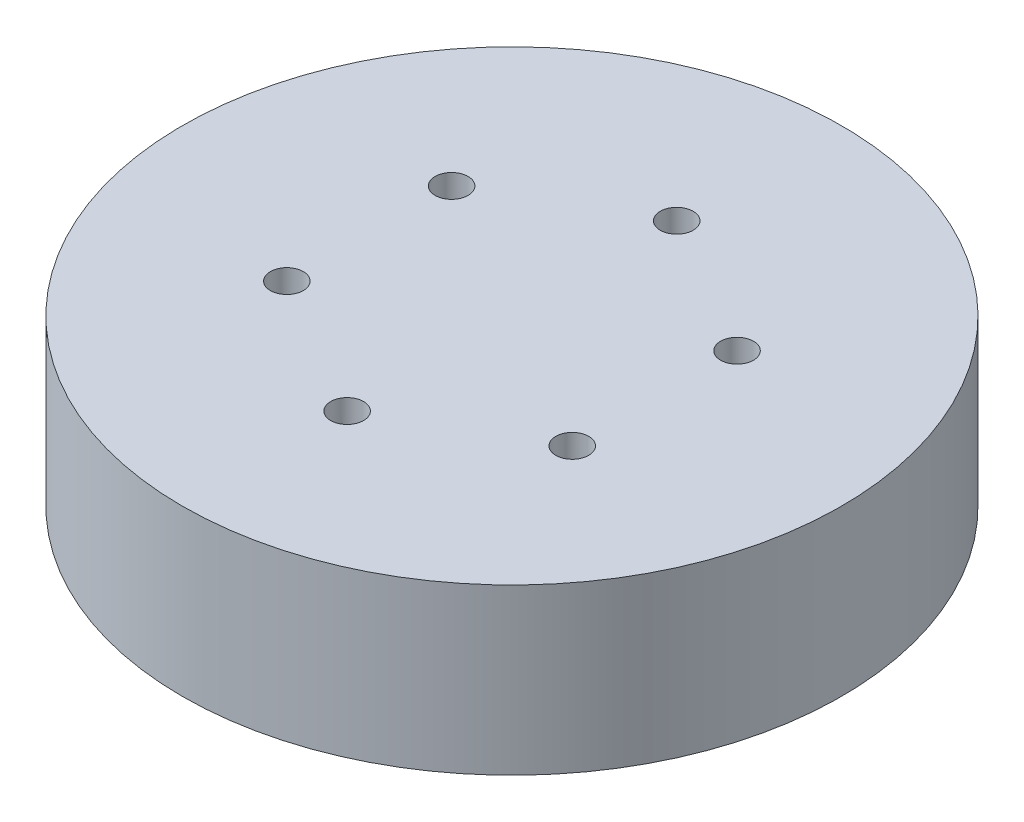
ISO-10303-21;
HEADER;
FILE_DESCRIPTION(('STEP AP214'),'2;1');
FILE_NAME('part.step','',(''),(''),'','','');
FILE_SCHEMA(('AUTOMOTIVE_DESIGN { 1 0 10303 214 1 1 1 1 }'));
ENDSEC;
DATA;
#1=APPLICATION_CONTEXT('core data for automotive mechanical design processes');
#2=APPLICATION_PROTOCOL_DEFINITION('international standard','automotive_design',2000,#1);
#3=PRODUCT_CONTEXT('',#1,'mechanical');
#4=PRODUCT('Part','Part','',(#3));
#5=PRODUCT_RELATED_PRODUCT_CATEGORY('part','',(#4));
#6=PRODUCT_DEFINITION_FORMATION('','',#4);
#7=PRODUCT_DEFINITION_CONTEXT('part definition',#1,'design');
#8=PRODUCT_DEFINITION('design','',#6,#7);
#9=PRODUCT_DEFINITION_SHAPE('','',#8);
#10=(LENGTH_UNIT() NAMED_UNIT(*) SI_UNIT(.MILLI.,.METRE.));
#11=(NAMED_UNIT(*) PLANE_ANGLE_UNIT() SI_UNIT($,.RADIAN.));
#12=(NAMED_UNIT(*) SI_UNIT($,.STERADIAN.) SOLID_ANGLE_UNIT());
#13=UNCERTAINTY_MEASURE_WITH_UNIT(LENGTH_MEASURE(1.E-05),#10,'distance_accuracy_value','');
#14=(GEOMETRIC_REPRESENTATION_CONTEXT(3) GLOBAL_UNCERTAINTY_ASSIGNED_CONTEXT((#13)) GLOBAL_UNIT_ASSIGNED_CONTEXT((#10,
#11,#12)) REPRESENTATION_CONTEXT('',''));
#15=CARTESIAN_POINT('',(0.,0.,0.));
#16=DIRECTION('',(0.,0.,1.));
#17=DIRECTION('',(1.,0.,0.));
#18=AXIS2_PLACEMENT_3D('',#15,#16,#17);
#19=CARTESIAN_POINT('',(0.,12.7,0.));
#20=DIRECTION('',(0.,-1.,0.));
#21=DIRECTION('',(0.,0.,-1.));
#22=AXIS2_PLACEMENT_3D('',#19,#20,#21);
#23=CYLINDRICAL_SURFACE('',#22,25.4);
#24=CARTESIAN_POINT('',(0.,12.7,0.));
#25=DIRECTION('',(0.,1.,0.));
#26=DIRECTION('',(0.,0.,1.));
#27=AXIS2_PLACEMENT_3D('',#24,#25,#26);
#28=CIRCLE('',#27,25.4);
#29=CARTESIAN_POINT('',(0.,12.7,25.4));
#30=VERTEX_POINT('',#29);
#31=EDGE_CURVE('E10',#30,#30,#28,.T.);
#32=ORIENTED_EDGE('',*,*,#31,.F.);
#33=EDGE_LOOP('',(#32));
#34=FACE_BOUND('',#33,.T.);
#35=CARTESIAN_POINT('',(0.,0.,0.));
#36=DIRECTION('',(0.,1.,0.));
#37=DIRECTION('',(0.,0.,1.));
#38=AXIS2_PLACEMENT_3D('',#35,#36,#37);
#39=CIRCLE('',#38,25.4);
#40=CARTESIAN_POINT('',(0.,0.,25.4));
#41=VERTEX_POINT('',#40);
#42=EDGE_CURVE('E46',#41,#41,#39,.T.);
#43=ORIENTED_EDGE('',*,*,#42,.T.);
#44=EDGE_LOOP('',(#43));
#45=FACE_BOUND('',#44,.T.);
#46=ADVANCED_FACE('F43',(#34,#45),#23,.T.);
#47=CARTESIAN_POINT('',(0.,12.7,0.));
#48=DIRECTION('',(0.,1.,0.));
#49=DIRECTION('',(0.,0.,1.));
#50=AXIS2_PLACEMENT_3D('',#47,#48,#49);
#51=PLANE('',#50);
#52=CARTESIAN_POINT('',(0.,12.7,-12.7));
#53=DIRECTION('',(0.,1.,0.));
#54=DIRECTION('',(0.,0.,1.));
#55=AXIS2_PLACEMENT_3D('',#52,#53,#54);
#56=CIRCLE('',#55,1.27);
#57=CARTESIAN_POINT('',(0.,12.7,-11.43));
#58=VERTEX_POINT('',#57);
#59=EDGE_CURVE('E90',#58,#58,#56,.T.);
#60=ORIENTED_EDGE('',*,*,#59,.F.);
#61=EDGE_LOOP('',(#60));
#62=FACE_BOUND('',#61,.T.);
#63=CARTESIAN_POINT('',(-10.9985226280623,12.7,-6.35000000000013));
#64=DIRECTION('',(0.,1.,0.));
#65=DIRECTION('',(0.,0.,1.));
#66=AXIS2_PLACEMENT_3D('',#63,#64,#65);
#67=CIRCLE('',#66,1.27);
#68=CARTESIAN_POINT('',(-10.9985226280623,12.7,-5.08000000000013));
#69=VERTEX_POINT('',#68);
#70=EDGE_CURVE('E62',#69,#69,#67,.T.);
#71=ORIENTED_EDGE('',*,*,#70,.F.);
#72=EDGE_LOOP('',(#71));
#73=FACE_BOUND('',#72,.T.);
#74=CARTESIAN_POINT('',(-10.9985226280624,12.7,6.3499999999999));
#75=DIRECTION('',(0.,1.,0.));
#76=DIRECTION('',(0.,0.,1.));
#77=AXIS2_PLACEMENT_3D('',#74,#75,#76);
#78=CIRCLE('',#77,1.27);
#79=CARTESIAN_POINT('',(-10.9985226280624,12.7,7.6199999999999));
#80=VERTEX_POINT('',#79);
#81=EDGE_CURVE('E61',#80,#80,#78,.T.);
#82=ORIENTED_EDGE('',*,*,#81,.F.);
#83=EDGE_LOOP('',(#82));
#84=FACE_BOUND('',#83,.T.);
#85=CARTESIAN_POINT('',(0.,12.7,12.7));
#86=DIRECTION('',(0.,1.,0.));
#87=DIRECTION('',(0.,0.,1.));
#88=AXIS2_PLACEMENT_3D('',#85,#86,#87);
#89=CIRCLE('',#88,1.27);
#90=CARTESIAN_POINT('',(0.,12.7,13.97));
#91=VERTEX_POINT('',#90);
#92=EDGE_CURVE('E70',#91,#91,#89,.T.);
#93=ORIENTED_EDGE('',*,*,#92,.F.);
#94=EDGE_LOOP('',(#93));
#95=FACE_BOUND('',#94,.T.);
#96=CARTESIAN_POINT('',(10.9985226280623,12.7,6.35000000000005));
#97=DIRECTION('',(0.,1.,0.));
#98=DIRECTION('',(0.,0.,1.));
#99=AXIS2_PLACEMENT_3D('',#96,#97,#98);
#100=CIRCLE('',#99,1.27);
#101=CARTESIAN_POINT('',(10.9985226280623,12.7,7.62000000000005));
#102=VERTEX_POINT('',#101);
#103=EDGE_CURVE('E78',#102,#102,#100,.T.);
#104=ORIENTED_EDGE('',*,*,#103,.F.);
#105=EDGE_LOOP('',(#104));
#106=FACE_BOUND('',#105,.T.);
#107=CARTESIAN_POINT('',(10.9985226280624,12.7,-6.34999999999997));
#108=DIRECTION('',(0.,1.,0.));
#109=DIRECTION('',(0.,0.,1.));
#110=AXIS2_PLACEMENT_3D('',#107,#108,#109);
#111=CIRCLE('',#110,1.27);
#112=CARTESIAN_POINT('',(10.9985226280624,12.7,-5.07999999999997));
#113=VERTEX_POINT('',#112);
#114=EDGE_CURVE('E86',#113,#113,#111,.T.);
#115=ORIENTED_EDGE('',*,*,#114,.F.);
#116=EDGE_LOOP('',(#115));
#117=FACE_BOUND('',#116,.T.);
#118=ORIENTED_EDGE('',*,*,#31,.T.);
#119=EDGE_LOOP('',(#118));
#120=FACE_BOUND('',#119,.T.);
#121=ADVANCED_FACE('F114',(#62,#73,#84,#95,#106,#117,#120),#51,.T.);
#122=CARTESIAN_POINT('',(0.,0.,0.));
#123=DIRECTION('',(0.,1.,0.));
#124=DIRECTION('',(0.,0.,1.));
#125=AXIS2_PLACEMENT_3D('',#122,#123,#124);
#126=PLANE('',#125);
#127=ORIENTED_EDGE('',*,*,#42,.F.);
#128=EDGE_LOOP('',(#127));
#129=FACE_BOUND('',#128,.T.);
#130=ADVANCED_FACE('F117',(#129),#126,.F.);
#131=CARTESIAN_POINT('',(10.9985226280624,6.35,-6.34999999999997));
#132=DIRECTION('',(0.,1.,0.));
#133=DIRECTION('',(0.,0.,1.));
#134=AXIS2_PLACEMENT_3D('',#131,#132,#133);
#135=CYLINDRICAL_SURFACE('',#134,1.27);
#136=CARTESIAN_POINT('',(10.9985226280624,6.35,-6.34999999999997));
#137=DIRECTION('',(0.,1.,0.));
#138=DIRECTION('',(0.,0.,1.));
#139=AXIS2_PLACEMENT_3D('',#136,#137,#138);
#140=CIRCLE('',#139,1.27);
#141=CARTESIAN_POINT('',(10.9985226280624,6.35,-5.07999999999997));
#142=VERTEX_POINT('',#141);
#143=EDGE_CURVE('E82',#142,#142,#140,.T.);
#144=ORIENTED_EDGE('',*,*,#143,.F.);
#145=EDGE_LOOP('',(#144));
#146=FACE_BOUND('',#145,.T.);
#147=ORIENTED_EDGE('',*,*,#114,.T.);
#148=EDGE_LOOP('',(#147));
#149=FACE_BOUND('',#148,.T.);
#150=ADVANCED_FACE('F129',(#146,#149),#135,.F.);
#151=CARTESIAN_POINT('',(10.9985226280624,6.35,-6.34999999999997));
#152=DIRECTION('',(0.,1.,0.));
#153=DIRECTION('',(0.,0.,1.));
#154=AXIS2_PLACEMENT_3D('',#151,#152,#153);
#155=PLANE('',#154);
#156=ORIENTED_EDGE('',*,*,#143,.T.);
#157=EDGE_LOOP('',(#156));
#158=FACE_BOUND('',#157,.T.);
#159=ADVANCED_FACE('F131',(#158),#155,.T.);
#160=CARTESIAN_POINT('',(10.9985226280623,6.35,6.35000000000005));
#161=DIRECTION('',(0.,1.,0.));
#162=DIRECTION('',(0.,0.,1.));
#163=AXIS2_PLACEMENT_3D('',#160,#161,#162);
#164=CYLINDRICAL_SURFACE('',#163,1.27);
#165=CARTESIAN_POINT('',(10.9985226280623,6.35,6.35000000000005));
#166=DIRECTION('',(0.,1.,0.));
#167=DIRECTION('',(0.,0.,1.));
#168=AXIS2_PLACEMENT_3D('',#165,#166,#167);
#169=CIRCLE('',#168,1.27);
#170=CARTESIAN_POINT('',(10.9985226280623,6.35,7.62000000000005));
#171=VERTEX_POINT('',#170);
#172=EDGE_CURVE('E74',#171,#171,#169,.T.);
#173=ORIENTED_EDGE('',*,*,#172,.F.);
#174=EDGE_LOOP('',(#173));
#175=FACE_BOUND('',#174,.T.);
#176=ORIENTED_EDGE('',*,*,#103,.T.);
#177=EDGE_LOOP('',(#176));
#178=FACE_BOUND('',#177,.T.);
#179=ADVANCED_FACE('F137',(#175,#178),#164,.F.);
#180=CARTESIAN_POINT('',(10.9985226280623,6.35,6.35000000000005));
#181=DIRECTION('',(0.,1.,0.));
#182=DIRECTION('',(0.,0.,1.));
#183=AXIS2_PLACEMENT_3D('',#180,#181,#182);
#184=PLANE('',#183);
#185=ORIENTED_EDGE('',*,*,#172,.T.);
#186=EDGE_LOOP('',(#185));
#187=FACE_BOUND('',#186,.T.);
#188=ADVANCED_FACE('F180',(#187),#184,.T.);
#189=CARTESIAN_POINT('',(0.,6.35,12.7));
#190=DIRECTION('',(0.,1.,0.));
#191=DIRECTION('',(0.,0.,1.));
#192=AXIS2_PLACEMENT_3D('',#189,#190,#191);
#193=CYLINDRICAL_SURFACE('',#192,1.27);
#194=CARTESIAN_POINT('',(0.,6.35,12.7));
#195=DIRECTION('',(0.,1.,0.));
#196=DIRECTION('',(0.,0.,1.));
#197=AXIS2_PLACEMENT_3D('',#194,#195,#196);
#198=CIRCLE('',#197,1.27);
#199=CARTESIAN_POINT('',(0.,6.35,13.97));
#200=VERTEX_POINT('',#199);
#201=EDGE_CURVE('E66',#200,#200,#198,.T.);
#202=ORIENTED_EDGE('',*,*,#201,.F.);
#203=EDGE_LOOP('',(#202));
#204=FACE_BOUND('',#203,.T.);
#205=ORIENTED_EDGE('',*,*,#92,.T.);
#206=EDGE_LOOP('',(#205));
#207=FACE_BOUND('',#206,.T.);
#208=ADVANCED_FACE('F189',(#204,#207),#193,.F.);
#209=CARTESIAN_POINT('',(0.,6.35,12.7));
#210=DIRECTION('',(0.,1.,0.));
#211=DIRECTION('',(0.,0.,1.));
#212=AXIS2_PLACEMENT_3D('',#209,#210,#211);
#213=PLANE('',#212);
#214=ORIENTED_EDGE('',*,*,#201,.T.);
#215=EDGE_LOOP('',(#214));
#216=FACE_BOUND('',#215,.T.);
#217=ADVANCED_FACE('F198',(#216),#213,.T.);
#218=CARTESIAN_POINT('',(-10.9985226280624,6.35,6.3499999999999));
#219=DIRECTION('',(0.,1.,0.));
#220=DIRECTION('',(0.,0.,1.));
#221=AXIS2_PLACEMENT_3D('',#218,#219,#220);
#222=CYLINDRICAL_SURFACE('',#221,1.27);
#223=CARTESIAN_POINT('',(-10.9985226280624,6.35,6.3499999999999));
#224=DIRECTION('',(0.,1.,0.));
#225=DIRECTION('',(0.,0.,1.));
#226=AXIS2_PLACEMENT_3D('',#223,#224,#225);
#227=CIRCLE('',#226,1.27);
#228=CARTESIAN_POINT('',(-10.9985226280624,6.35,7.6199999999999));
#229=VERTEX_POINT('',#228);
#230=EDGE_CURVE('E57',#229,#229,#227,.T.);
#231=ORIENTED_EDGE('',*,*,#230,.F.);
#232=EDGE_LOOP('',(#231));
#233=FACE_BOUND('',#232,.T.);
#234=ORIENTED_EDGE('',*,*,#81,.T.);
#235=EDGE_LOOP('',(#234));
#236=FACE_BOUND('',#235,.T.);
#237=ADVANCED_FACE('F207',(#233,#236),#222,.F.);
#238=CARTESIAN_POINT('',(-10.9985226280624,6.35,6.3499999999999));
#239=DIRECTION('',(0.,1.,0.));
#240=DIRECTION('',(0.,0.,1.));
#241=AXIS2_PLACEMENT_3D('',#238,#239,#240);
#242=PLANE('',#241);
#243=ORIENTED_EDGE('',*,*,#230,.T.);
#244=EDGE_LOOP('',(#243));
#245=FACE_BOUND('',#244,.T.);
#246=ADVANCED_FACE('F216',(#245),#242,.T.);
#247=CARTESIAN_POINT('',(-10.9985226280623,6.35,-6.35000000000013));
#248=DIRECTION('',(0.,1.,0.));
#249=DIRECTION('',(0.,0.,1.));
#250=AXIS2_PLACEMENT_3D('',#247,#248,#249);
#251=CYLINDRICAL_SURFACE('',#250,1.27);
#252=CARTESIAN_POINT('',(-10.9985226280623,6.35,-6.35000000000013));
#253=DIRECTION('',(0.,1.,0.));
#254=DIRECTION('',(0.,0.,1.));
#255=AXIS2_PLACEMENT_3D('',#252,#253,#254);
#256=CIRCLE('',#255,1.27);
#257=CARTESIAN_POINT('',(-10.9985226280623,6.35,-5.08000000000013));
#258=VERTEX_POINT('',#257);
#259=EDGE_CURVE('E91',#258,#258,#256,.T.);
#260=ORIENTED_EDGE('',*,*,#259,.F.);
#261=EDGE_LOOP('',(#260));
#262=FACE_BOUND('',#261,.T.);
#263=ORIENTED_EDGE('',*,*,#70,.T.);
#264=EDGE_LOOP('',(#263));
#265=FACE_BOUND('',#264,.T.);
#266=ADVANCED_FACE('F225',(#262,#265),#251,.F.);
#267=CARTESIAN_POINT('',(-10.9985226280623,6.35,-6.35000000000013));
#268=DIRECTION('',(0.,1.,0.));
#269=DIRECTION('',(0.,0.,1.));
#270=AXIS2_PLACEMENT_3D('',#267,#268,#269);
#271=PLANE('',#270);
#272=ORIENTED_EDGE('',*,*,#259,.T.);
#273=EDGE_LOOP('',(#272));
#274=FACE_BOUND('',#273,.T.);
#275=ADVANCED_FACE('F110',(#274),#271,.T.);
#276=CARTESIAN_POINT('',(0.,6.35,-12.7));
#277=DIRECTION('',(0.,1.,0.));
#278=DIRECTION('',(0.,0.,1.));
#279=AXIS2_PLACEMENT_3D('',#276,#277,#278);
#280=CYLINDRICAL_SURFACE('',#279,1.27);
#281=CARTESIAN_POINT('',(0.,6.35,-12.7));
#282=DIRECTION('',(0.,1.,0.));
#283=DIRECTION('',(0.,0.,1.));
#284=AXIS2_PLACEMENT_3D('',#281,#282,#283);
#285=CIRCLE('',#284,1.27);
#286=CARTESIAN_POINT('',(0.,6.35,-11.43));
#287=VERTEX_POINT('',#286);
#288=EDGE_CURVE('E55',#287,#287,#285,.T.);
#289=ORIENTED_EDGE('',*,*,#288,.F.);
#290=EDGE_LOOP('',(#289));
#291=FACE_BOUND('',#290,.T.);
#292=ORIENTED_EDGE('',*,*,#59,.T.);
#293=EDGE_LOOP('',(#292));
#294=FACE_BOUND('',#293,.T.);
#295=ADVANCED_FACE('F107',(#291,#294),#280,.F.);
#296=CARTESIAN_POINT('',(0.,6.35,-12.7));
#297=DIRECTION('',(0.,1.,0.));
#298=DIRECTION('',(0.,0.,1.));
#299=AXIS2_PLACEMENT_3D('',#296,#297,#298);
#300=PLANE('',#299);
#301=ORIENTED_EDGE('',*,*,#288,.T.);
#302=EDGE_LOOP('',(#301));
#303=FACE_BOUND('',#302,.T.);
#304=ADVANCED_FACE('F105',(#303),#300,.T.);
#305=CLOSED_SHELL('',(#46,#121,#130,#150,#159,#179,#188,#208,#217,#237,#246,#266,#275,#295,#304));
#306=MANIFOLD_SOLID_BREP('B2',#305);
#307=ADVANCED_BREP_SHAPE_REPRESENTATION('',(#18,#306),#14);
#308=SHAPE_DEFINITION_REPRESENTATION(#9,#307);
ENDSEC;
END-ISO-10303-21;
